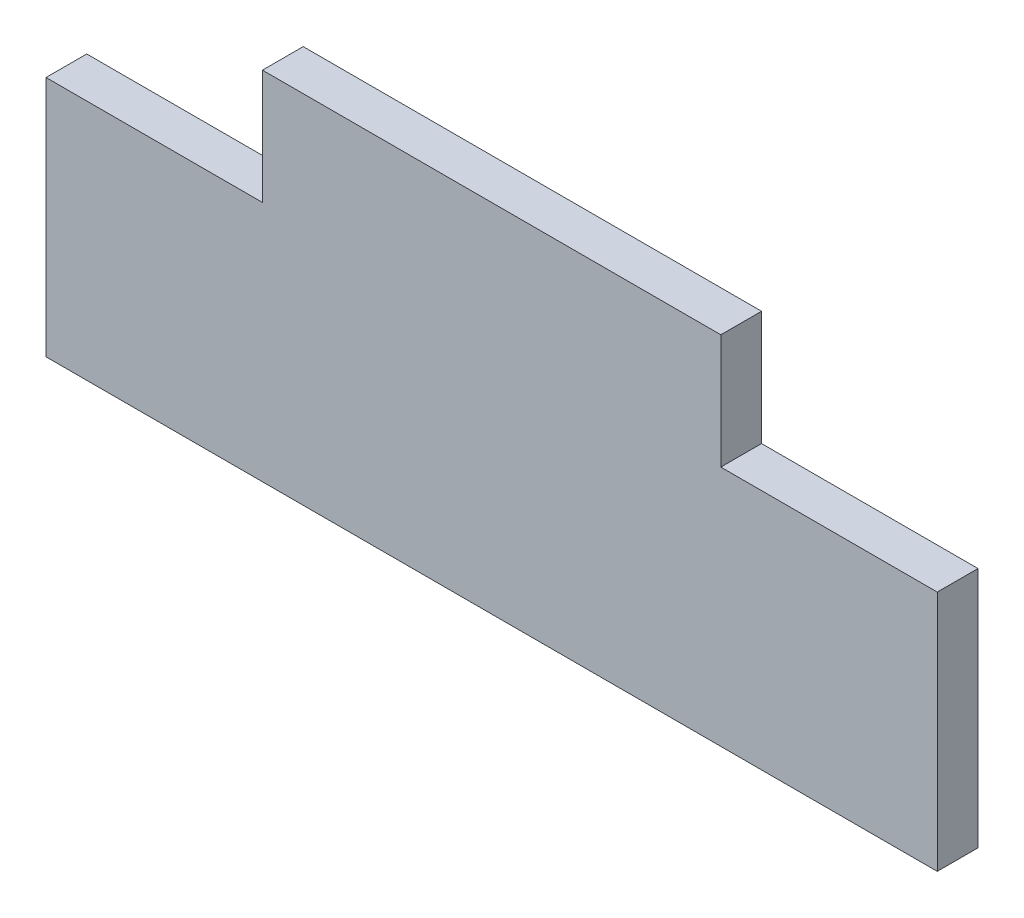
ISO-10303-21;
HEADER;
FILE_DESCRIPTION(('STEP AP214'),'2;1');
FILE_NAME('part.step','',(''),(''),'','','');
FILE_SCHEMA(('AUTOMOTIVE_DESIGN { 1 0 10303 214 1 1 1 1 }'));
ENDSEC;
DATA;
#1=APPLICATION_CONTEXT('core data for automotive mechanical design processes');
#2=APPLICATION_PROTOCOL_DEFINITION('international standard','automotive_design',2000,#1);
#3=PRODUCT_CONTEXT('',#1,'mechanical');
#4=PRODUCT('Part','Part','',(#3));
#5=PRODUCT_RELATED_PRODUCT_CATEGORY('part','',(#4));
#6=PRODUCT_DEFINITION_FORMATION('','',#4);
#7=PRODUCT_DEFINITION_CONTEXT('part definition',#1,'design');
#8=PRODUCT_DEFINITION('design','',#6,#7);
#9=PRODUCT_DEFINITION_SHAPE('','',#8);
#10=(LENGTH_UNIT() NAMED_UNIT(*) SI_UNIT(.MILLI.,.METRE.));
#11=(NAMED_UNIT(*) PLANE_ANGLE_UNIT() SI_UNIT($,.RADIAN.));
#12=(NAMED_UNIT(*) SI_UNIT($,.STERADIAN.) SOLID_ANGLE_UNIT());
#13=UNCERTAINTY_MEASURE_WITH_UNIT(LENGTH_MEASURE(1.E-05),#10,'distance_accuracy_value','');
#14=(GEOMETRIC_REPRESENTATION_CONTEXT(3) GLOBAL_UNCERTAINTY_ASSIGNED_CONTEXT((#13)) GLOBAL_UNIT_ASSIGNED_CONTEXT((#10,
#11,#12)) REPRESENTATION_CONTEXT('',''));
#15=CARTESIAN_POINT('',(0.,0.,0.));
#16=DIRECTION('',(0.,0.,1.));
#17=DIRECTION('',(1.,0.,0.));
#18=AXIS2_PLACEMENT_3D('',#15,#16,#17);
#19=CARTESIAN_POINT('',(8.5,14.,1.6));
#20=DIRECTION('',(1.,0.,0.));
#21=DIRECTION('',(0.,0.,-1.));
#22=AXIS2_PLACEMENT_3D('',#19,#20,#21);
#23=PLANE('',#22);
#24=DIRECTION('',(0.,-1.,0.));
#25=VECTOR('',#24,1.);
#26=CARTESIAN_POINT('',(8.5,14.,0.));
#27=LINE('',#26,#25);
#28=CARTESIAN_POINT('',(8.5,14.,0.));
#29=VERTEX_POINT('',#28);
#30=CARTESIAN_POINT('',(8.5,9.5,0.));
#31=VERTEX_POINT('',#30);
#32=EDGE_CURVE('E144',#29,#31,#27,.T.);
#33=ORIENTED_EDGE('',*,*,#32,.T.);
#34=DIRECTION('',(0.,0.,-1.));
#35=VECTOR('',#34,1.);
#36=CARTESIAN_POINT('',(8.5,9.5,1.6));
#37=LINE('',#36,#35);
#38=CARTESIAN_POINT('',(8.5,9.5,1.6));
#39=VERTEX_POINT('',#38);
#40=EDGE_CURVE('E11',#39,#31,#37,.T.);
#41=ORIENTED_EDGE('',*,*,#40,.F.);
#42=DIRECTION('',(0.,-1.,0.));
#43=VECTOR('',#42,1.);
#44=CARTESIAN_POINT('',(8.5,14.,1.6));
#45=LINE('',#44,#43);
#46=CARTESIAN_POINT('',(8.5,14.,1.6));
#47=VERTEX_POINT('',#46);
#48=EDGE_CURVE('E166',#47,#39,#45,.T.);
#49=ORIENTED_EDGE('',*,*,#48,.F.);
#50=DIRECTION('',(0.,0.,-1.));
#51=VECTOR('',#50,1.);
#52=CARTESIAN_POINT('',(8.5,14.,1.6));
#53=LINE('',#52,#51);
#54=EDGE_CURVE('E140',#47,#29,#53,.T.);
#55=ORIENTED_EDGE('',*,*,#54,.T.);
#56=EDGE_LOOP('',(#33,#41,#49,#55));
#57=FACE_BOUND('',#56,.T.);
#58=ADVANCED_FACE('F43',(#57),#23,.F.);
#59=CARTESIAN_POINT('',(8.5,9.5,1.6));
#60=DIRECTION('',(0.,-1.,0.));
#61=DIRECTION('',(0.,0.,-1.));
#62=AXIS2_PLACEMENT_3D('',#59,#60,#61);
#63=PLANE('',#62);
#64=DIRECTION('',(-1.,0.,0.));
#65=VECTOR('',#64,1.);
#66=CARTESIAN_POINT('',(8.5,9.5,0.));
#67=LINE('',#66,#65);
#68=CARTESIAN_POINT('',(0.,9.5,0.));
#69=VERTEX_POINT('',#68);
#70=EDGE_CURVE('E148',#31,#69,#67,.T.);
#71=ORIENTED_EDGE('',*,*,#70,.T.);
#72=DIRECTION('',(0.,0.,-1.));
#73=VECTOR('',#72,1.);
#74=CARTESIAN_POINT('',(0.,9.5,1.6));
#75=LINE('',#74,#73);
#76=CARTESIAN_POINT('',(0.,9.5,1.6));
#77=VERTEX_POINT('',#76);
#78=EDGE_CURVE('E52',#77,#69,#75,.T.);
#79=ORIENTED_EDGE('',*,*,#78,.F.);
#80=DIRECTION('',(-1.,0.,0.));
#81=VECTOR('',#80,1.);
#82=CARTESIAN_POINT('',(8.5,9.5,1.6));
#83=LINE('',#82,#81);
#84=EDGE_CURVE('E103',#39,#77,#83,.T.);
#85=ORIENTED_EDGE('',*,*,#84,.F.);
#86=ORIENTED_EDGE('',*,*,#40,.T.);
#87=EDGE_LOOP('',(#71,#79,#85,#86));
#88=FACE_BOUND('',#87,.T.);
#89=ADVANCED_FACE('F212',(#88),#63,.F.);
#90=CARTESIAN_POINT('',(0.,9.5,1.6));
#91=DIRECTION('',(1.,0.,0.));
#92=DIRECTION('',(0.,1.,0.));
#93=AXIS2_PLACEMENT_3D('',#90,#91,#92);
#94=PLANE('',#93);
#95=DIRECTION('',(0.,-1.,0.));
#96=VECTOR('',#95,1.);
#97=CARTESIAN_POINT('',(0.,9.5,0.));
#98=LINE('',#97,#96);
#99=CARTESIAN_POINT('',(0.,0.,0.));
#100=VERTEX_POINT('',#99);
#101=EDGE_CURVE('E151',#69,#100,#98,.T.);
#102=ORIENTED_EDGE('',*,*,#101,.T.);
#103=DIRECTION('',(0.,0.,-1.));
#104=VECTOR('',#103,1.);
#105=CARTESIAN_POINT('',(0.,0.,1.6));
#106=LINE('',#105,#104);
#107=CARTESIAN_POINT('',(0.,0.,1.6));
#108=VERTEX_POINT('',#107);
#109=EDGE_CURVE('E177',#108,#100,#106,.T.);
#110=ORIENTED_EDGE('',*,*,#109,.F.);
#111=DIRECTION('',(0.,-1.,0.));
#112=VECTOR('',#111,1.);
#113=CARTESIAN_POINT('',(0.,9.5,1.6));
#114=LINE('',#113,#112);
#115=EDGE_CURVE('E187',#77,#108,#114,.T.);
#116=ORIENTED_EDGE('',*,*,#115,.F.);
#117=ORIENTED_EDGE('',*,*,#78,.T.);
#118=EDGE_LOOP('',(#102,#110,#116,#117));
#119=FACE_BOUND('',#118,.T.);
#120=ADVANCED_FACE('F185',(#119),#94,.F.);
#121=CARTESIAN_POINT('',(0.,0.,1.6));
#122=DIRECTION('',(0.,1.,0.));
#123=DIRECTION('',(0.,0.,1.));
#124=AXIS2_PLACEMENT_3D('',#121,#122,#123);
#125=PLANE('',#124);
#126=DIRECTION('',(1.,0.,0.));
#127=VECTOR('',#126,1.);
#128=CARTESIAN_POINT('',(0.,0.,0.));
#129=LINE('',#128,#127);
#130=CARTESIAN_POINT('',(35.,0.,0.));
#131=VERTEX_POINT('',#130);
#132=EDGE_CURVE('E154',#100,#131,#129,.T.);
#133=ORIENTED_EDGE('',*,*,#132,.T.);
#134=DIRECTION('',(0.,0.,-1.));
#135=VECTOR('',#134,1.);
#136=CARTESIAN_POINT('',(35.,0.,1.6));
#137=LINE('',#136,#135);
#138=CARTESIAN_POINT('',(35.,0.,1.6));
#139=VERTEX_POINT('',#138);
#140=EDGE_CURVE('E173',#139,#131,#137,.T.);
#141=ORIENTED_EDGE('',*,*,#140,.F.);
#142=DIRECTION('',(1.,0.,0.));
#143=VECTOR('',#142,1.);
#144=CARTESIAN_POINT('',(0.,0.,1.6));
#145=LINE('',#144,#143);
#146=EDGE_CURVE('E200',#108,#139,#145,.T.);
#147=ORIENTED_EDGE('',*,*,#146,.F.);
#148=ORIENTED_EDGE('',*,*,#109,.T.);
#149=EDGE_LOOP('',(#133,#141,#147,#148));
#150=FACE_BOUND('',#149,.T.);
#151=ADVANCED_FACE('F195',(#150),#125,.F.);
#152=CARTESIAN_POINT('',(35.,0.,1.6));
#153=DIRECTION('',(-1.,0.,0.));
#154=DIRECTION('',(0.,0.,1.));
#155=AXIS2_PLACEMENT_3D('',#152,#153,#154);
#156=PLANE('',#155);
#157=DIRECTION('',(0.,1.,0.));
#158=VECTOR('',#157,1.);
#159=CARTESIAN_POINT('',(35.,0.,0.));
#160=LINE('',#159,#158);
#161=CARTESIAN_POINT('',(35.,9.5,0.));
#162=VERTEX_POINT('',#161);
#163=EDGE_CURVE('E157',#131,#162,#160,.T.);
#164=ORIENTED_EDGE('',*,*,#163,.T.);
#165=DIRECTION('',(0.,0.,-1.));
#166=VECTOR('',#165,1.);
#167=CARTESIAN_POINT('',(35.,9.5,1.6));
#168=LINE('',#167,#166);
#169=CARTESIAN_POINT('',(35.,9.5,1.6));
#170=VERTEX_POINT('',#169);
#171=EDGE_CURVE('E133',#170,#162,#168,.T.);
#172=ORIENTED_EDGE('',*,*,#171,.F.);
#173=DIRECTION('',(0.,1.,0.));
#174=VECTOR('',#173,1.);
#175=CARTESIAN_POINT('',(35.,0.,1.6));
#176=LINE('',#175,#174);
#177=EDGE_CURVE('E122',#139,#170,#176,.T.);
#178=ORIENTED_EDGE('',*,*,#177,.F.);
#179=ORIENTED_EDGE('',*,*,#140,.T.);
#180=EDGE_LOOP('',(#164,#172,#178,#179));
#181=FACE_BOUND('',#180,.T.);
#182=ADVANCED_FACE('F198',(#181),#156,.F.);
#183=CARTESIAN_POINT('',(35.,9.5,1.6));
#184=DIRECTION('',(0.,-1.,0.));
#185=DIRECTION('',(1.,0.,0.));
#186=AXIS2_PLACEMENT_3D('',#183,#184,#185);
#187=PLANE('',#186);
#188=DIRECTION('',(-1.,0.,0.));
#189=VECTOR('',#188,1.);
#190=CARTESIAN_POINT('',(35.,9.5,0.));
#191=LINE('',#190,#189);
#192=CARTESIAN_POINT('',(26.5,9.5,0.));
#193=VERTEX_POINT('',#192);
#194=EDGE_CURVE('E131',#162,#193,#191,.T.);
#195=ORIENTED_EDGE('',*,*,#194,.T.);
#196=DIRECTION('',(0.,0.,-1.));
#197=VECTOR('',#196,1.);
#198=CARTESIAN_POINT('',(26.5,9.5,1.6));
#199=LINE('',#198,#197);
#200=CARTESIAN_POINT('',(26.5,9.5,1.6));
#201=VERTEX_POINT('',#200);
#202=EDGE_CURVE('E128',#201,#193,#199,.T.);
#203=ORIENTED_EDGE('',*,*,#202,.F.);
#204=DIRECTION('',(-1.,0.,0.));
#205=VECTOR('',#204,1.);
#206=CARTESIAN_POINT('',(35.,9.5,1.6));
#207=LINE('',#206,#205);
#208=EDGE_CURVE('E116',#170,#201,#207,.T.);
#209=ORIENTED_EDGE('',*,*,#208,.F.);
#210=ORIENTED_EDGE('',*,*,#171,.T.);
#211=EDGE_LOOP('',(#195,#203,#209,#210));
#212=FACE_BOUND('',#211,.T.);
#213=ADVANCED_FACE('F129',(#212),#187,.F.);
#214=CARTESIAN_POINT('',(26.5,9.5,1.6));
#215=DIRECTION('',(-1.,0.,0.));
#216=DIRECTION('',(0.,0.,1.));
#217=AXIS2_PLACEMENT_3D('',#214,#215,#216);
#218=PLANE('',#217);
#219=DIRECTION('',(0.,1.,0.));
#220=VECTOR('',#219,1.);
#221=CARTESIAN_POINT('',(26.5,9.5,0.));
#222=LINE('',#221,#220);
#223=CARTESIAN_POINT('',(26.5,14.,0.));
#224=VERTEX_POINT('',#223);
#225=EDGE_CURVE('E89',#193,#224,#222,.T.);
#226=ORIENTED_EDGE('',*,*,#225,.T.);
#227=DIRECTION('',(0.,0.,-1.));
#228=VECTOR('',#227,1.);
#229=CARTESIAN_POINT('',(26.5,14.,1.6));
#230=LINE('',#229,#228);
#231=CARTESIAN_POINT('',(26.5,14.,1.6));
#232=VERTEX_POINT('',#231);
#233=EDGE_CURVE('E134',#232,#224,#230,.T.);
#234=ORIENTED_EDGE('',*,*,#233,.F.);
#235=DIRECTION('',(0.,1.,0.));
#236=VECTOR('',#235,1.);
#237=CARTESIAN_POINT('',(26.5,9.5,1.6));
#238=LINE('',#237,#236);
#239=EDGE_CURVE('E120',#201,#232,#238,.T.);
#240=ORIENTED_EDGE('',*,*,#239,.F.);
#241=ORIENTED_EDGE('',*,*,#202,.T.);
#242=EDGE_LOOP('',(#226,#234,#240,#241));
#243=FACE_BOUND('',#242,.T.);
#244=ADVANCED_FACE('F136',(#243),#218,.F.);
#245=CARTESIAN_POINT('',(26.5,14.,1.6));
#246=DIRECTION('',(0.,-1.,0.));
#247=DIRECTION('',(1.,0.,0.));
#248=AXIS2_PLACEMENT_3D('',#245,#246,#247);
#249=PLANE('',#248);
#250=DIRECTION('',(-1.,0.,0.));
#251=VECTOR('',#250,1.);
#252=CARTESIAN_POINT('',(26.5,14.,0.));
#253=LINE('',#252,#251);
#254=EDGE_CURVE('E95',#224,#29,#253,.T.);
#255=ORIENTED_EDGE('',*,*,#254,.T.);
#256=ORIENTED_EDGE('',*,*,#54,.F.);
#257=DIRECTION('',(-1.,0.,0.));
#258=VECTOR('',#257,1.);
#259=CARTESIAN_POINT('',(26.5,14.,1.6));
#260=LINE('',#259,#258);
#261=EDGE_CURVE('E60',#232,#47,#260,.T.);
#262=ORIENTED_EDGE('',*,*,#261,.F.);
#263=ORIENTED_EDGE('',*,*,#233,.T.);
#264=EDGE_LOOP('',(#255,#256,#262,#263));
#265=FACE_BOUND('',#264,.T.);
#266=ADVANCED_FACE('F228',(#265),#249,.F.);
#267=CARTESIAN_POINT('',(0.,0.,1.6));
#268=DIRECTION('',(0.,0.,-1.));
#269=DIRECTION('',(-1.,0.,0.));
#270=AXIS2_PLACEMENT_3D('',#267,#268,#269);
#271=PLANE('',#270);
#272=ORIENTED_EDGE('',*,*,#48,.T.);
#273=ORIENTED_EDGE('',*,*,#84,.T.);
#274=ORIENTED_EDGE('',*,*,#115,.T.);
#275=ORIENTED_EDGE('',*,*,#146,.T.);
#276=ORIENTED_EDGE('',*,*,#177,.T.);
#277=ORIENTED_EDGE('',*,*,#208,.T.);
#278=ORIENTED_EDGE('',*,*,#239,.T.);
#279=ORIENTED_EDGE('',*,*,#261,.T.);
#280=EDGE_LOOP('',(#272,#273,#274,#275,#276,#277,#278,#279));
#281=FACE_BOUND('',#280,.T.);
#282=ADVANCED_FACE('F118',(#281),#271,.F.);
#283=CARTESIAN_POINT('',(0.,0.,0.));
#284=DIRECTION('',(0.,0.,-1.));
#285=DIRECTION('',(-1.,0.,0.));
#286=AXIS2_PLACEMENT_3D('',#283,#284,#285);
#287=PLANE('',#286);
#288=ORIENTED_EDGE('',*,*,#32,.F.);
#289=ORIENTED_EDGE('',*,*,#254,.F.);
#290=ORIENTED_EDGE('',*,*,#225,.F.);
#291=ORIENTED_EDGE('',*,*,#194,.F.);
#292=ORIENTED_EDGE('',*,*,#163,.F.);
#293=ORIENTED_EDGE('',*,*,#132,.F.);
#294=ORIENTED_EDGE('',*,*,#101,.F.);
#295=ORIENTED_EDGE('',*,*,#70,.F.);
#296=EDGE_LOOP('',(#288,#289,#290,#291,#292,#293,#294,#295));
#297=FACE_BOUND('',#296,.T.);
#298=ADVANCED_FACE('F191',(#297),#287,.T.);
#299=CLOSED_SHELL('',(#58,#89,#120,#151,#182,#213,#244,#266,#282,#298));
#300=MANIFOLD_SOLID_BREP('B2',#299);
#301=ADVANCED_BREP_SHAPE_REPRESENTATION('',(#18,#300),#14);
#302=SHAPE_DEFINITION_REPRESENTATION(#9,#301);
ENDSEC;
END-ISO-10303-21;
